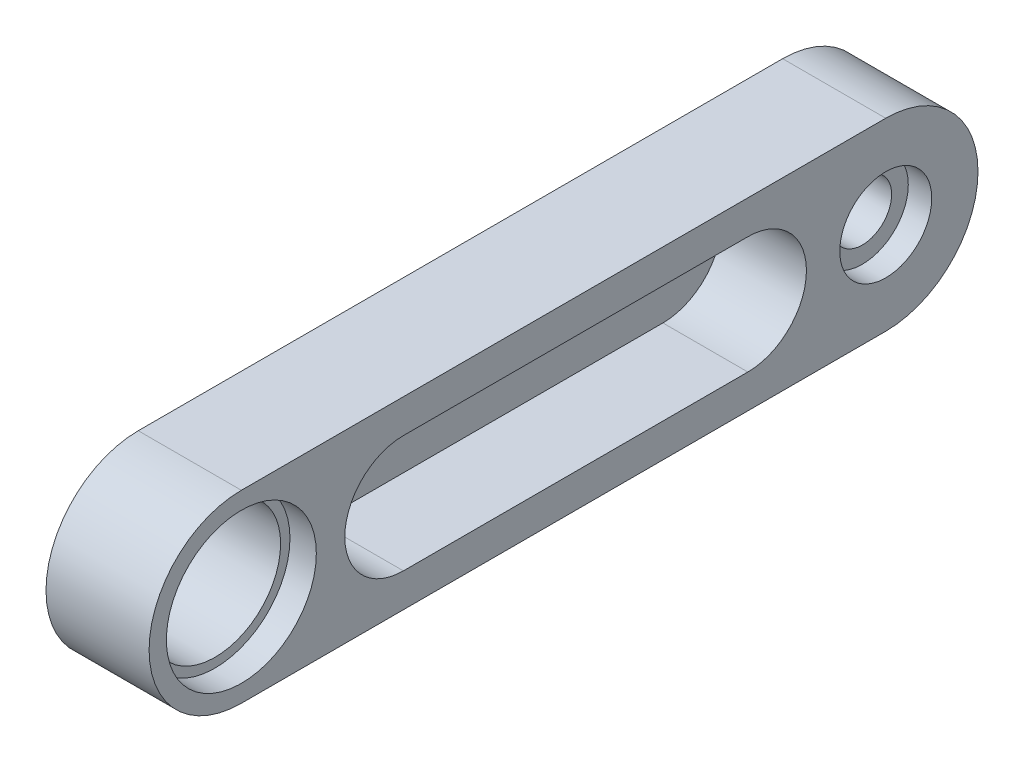
ISO-10303-21;
HEADER;
FILE_DESCRIPTION(('STEP AP214'),'2;1');
FILE_NAME('part.step','',(''),(''),'','','');
FILE_SCHEMA(('AUTOMOTIVE_DESIGN { 1 0 10303 214 1 1 1 1 }'));
ENDSEC;
DATA;
#1=APPLICATION_CONTEXT('core data for automotive mechanical design processes');
#2=APPLICATION_PROTOCOL_DEFINITION('international standard','automotive_design',2000,#1);
#3=PRODUCT_CONTEXT('',#1,'mechanical');
#4=PRODUCT('Part','Part','',(#3));
#5=PRODUCT_RELATED_PRODUCT_CATEGORY('part','',(#4));
#6=PRODUCT_DEFINITION_FORMATION('','',#4);
#7=PRODUCT_DEFINITION_CONTEXT('part definition',#1,'design');
#8=PRODUCT_DEFINITION('design','',#6,#7);
#9=PRODUCT_DEFINITION_SHAPE('','',#8);
#10=(LENGTH_UNIT() NAMED_UNIT(*) SI_UNIT(.MILLI.,.METRE.));
#11=(NAMED_UNIT(*) PLANE_ANGLE_UNIT() SI_UNIT($,.RADIAN.));
#12=(NAMED_UNIT(*) SI_UNIT($,.STERADIAN.) SOLID_ANGLE_UNIT());
#13=UNCERTAINTY_MEASURE_WITH_UNIT(LENGTH_MEASURE(1.E-05),#10,'distance_accuracy_value','');
#14=(GEOMETRIC_REPRESENTATION_CONTEXT(3) GLOBAL_UNCERTAINTY_ASSIGNED_CONTEXT((#13)) GLOBAL_UNIT_ASSIGNED_CONTEXT((#10,
#11,#12)) REPRESENTATION_CONTEXT('',''));
#15=CARTESIAN_POINT('',(0.,0.,0.));
#16=DIRECTION('',(0.,0.,1.));
#17=DIRECTION('',(1.,0.,0.));
#18=AXIS2_PLACEMENT_3D('',#15,#16,#17);
#19=CARTESIAN_POINT('',(3.48304055279405,0.,-22.9683038027636));
#20=DIRECTION('',(-1.,0.,0.));
#21=DIRECTION('',(0.,0.,1.));
#22=AXIS2_PLACEMENT_3D('',#19,#20,#21);
#23=CYLINDRICAL_SURFACE('',#22,0.762000000000001);
#24=CARTESIAN_POINT('',(0.800800552794053,0.,-22.9683038027636));
#25=DIRECTION('',(1.,0.,0.));
#26=DIRECTION('',(0.,0.,-1.));
#27=AXIS2_PLACEMENT_3D('',#24,#25,#26);
#28=CIRCLE('',#27,0.762000000000001);
#29=CARTESIAN_POINT('',(0.800800552794053,0.,-23.7303038027636));
#30=VERTEX_POINT('',#29);
#31=EDGE_CURVE('E162',#30,#30,#28,.T.);
#32=ORIENTED_EDGE('',*,*,#31,.F.);
#33=EDGE_LOOP('',(#32));
#34=FACE_BOUND('',#33,.T.);
#35=CARTESIAN_POINT('',(2.87344055279405,0.,-22.9683038027636));
#36=DIRECTION('',(1.,0.,0.));
#37=DIRECTION('',(0.,0.,-1.));
#38=AXIS2_PLACEMENT_3D('',#35,#36,#37);
#39=CIRCLE('',#38,0.762000000000001);
#40=CARTESIAN_POINT('',(2.87344055279405,0.,-23.7303038027636));
#41=VERTEX_POINT('',#40);
#42=EDGE_CURVE('E39',#41,#41,#39,.T.);
#43=ORIENTED_EDGE('',*,*,#42,.T.);
#44=EDGE_LOOP('',(#43));
#45=FACE_BOUND('',#44,.T.);
#46=ADVANCED_FACE('F35',(#34,#45),#23,.F.);
#47=CARTESIAN_POINT('',(3.48304055279405,0.,-6.20430380276362));
#48=DIRECTION('',(-1.,0.,0.));
#49=DIRECTION('',(0.,0.,1.));
#50=AXIS2_PLACEMENT_3D('',#47,#48,#49);
#51=CYLINDRICAL_SURFACE('',#50,1.70688);
#52=CARTESIAN_POINT('',(0.800800552794053,0.,-6.20430380276362));
#53=DIRECTION('',(1.,0.,0.));
#54=DIRECTION('',(0.,0.,-1.));
#55=AXIS2_PLACEMENT_3D('',#52,#53,#54);
#56=CIRCLE('',#55,1.70688);
#57=CARTESIAN_POINT('',(0.800800552794053,0.,-7.91118380276362));
#58=VERTEX_POINT('',#57);
#59=EDGE_CURVE('E165',#58,#58,#56,.T.);
#60=ORIENTED_EDGE('',*,*,#59,.F.);
#61=EDGE_LOOP('',(#60));
#62=FACE_BOUND('',#61,.T.);
#63=CARTESIAN_POINT('',(2.79724055279405,0.,-6.20430380276362));
#64=DIRECTION('',(1.,0.,0.));
#65=DIRECTION('',(0.,0.,-1.));
#66=AXIS2_PLACEMENT_3D('',#63,#64,#65);
#67=CIRCLE('',#66,1.70688);
#68=CARTESIAN_POINT('',(2.79724055279405,0.,-7.91118380276362));
#69=VERTEX_POINT('',#68);
#70=EDGE_CURVE('E158',#69,#69,#67,.T.);
#71=ORIENTED_EDGE('',*,*,#70,.T.);
#72=EDGE_LOOP('',(#71));
#73=FACE_BOUND('',#72,.T.);
#74=ADVANCED_FACE('F190',(#62,#73),#51,.F.);
#75=CARTESIAN_POINT('',(3.48304055279405,0.,-6.20430380276362));
#76=DIRECTION('',(1.,0.,0.));
#77=DIRECTION('',(0.,0.,-1.));
#78=AXIS2_PLACEMENT_3D('',#75,#76,#77);
#79=PLANE('',#78);
#80=CARTESIAN_POINT('',(3.48304055279405,0.,-10.4198990626785));
#81=DIRECTION('',(1.,0.,0.));
#82=DIRECTION('',(0.,0.,-1.));
#83=AXIS2_PLACEMENT_3D('',#80,#81,#82);
#84=CIRCLE('',#83,1.524);
#85=CARTESIAN_POINT('',(3.48304055279405,1.524,-10.4198990626785));
#86=VERTEX_POINT('',#85);
#87=CARTESIAN_POINT('',(3.48304055279405,-1.524,-10.4198990626785));
#88=VERTEX_POINT('',#87);
#89=EDGE_CURVE('E52',#86,#88,#84,.T.);
#90=ORIENTED_EDGE('',*,*,#89,.F.);
#91=DIRECTION('',(0.,0.,1.));
#92=VECTOR('',#91,1.);
#93=CARTESIAN_POINT('',(3.48304055279405,1.524,-10.4198990626785));
#94=LINE('',#93,#92);
#95=CARTESIAN_POINT('',(3.48304055279405,1.524,-19.3810190626785));
#96=VERTEX_POINT('',#95);
#97=EDGE_CURVE('E131',#96,#86,#94,.T.);
#98=ORIENTED_EDGE('',*,*,#97,.F.);
#99=CARTESIAN_POINT('',(3.48304055279405,0.,-19.3810190626785));
#100=DIRECTION('',(1.,0.,0.));
#101=DIRECTION('',(0.,0.,-1.));
#102=AXIS2_PLACEMENT_3D('',#99,#100,#101);
#103=CIRCLE('',#102,1.524);
#104=CARTESIAN_POINT('',(3.48304055279405,-1.524,-19.3810190626785));
#105=VERTEX_POINT('',#104);
#106=EDGE_CURVE('E134',#105,#96,#103,.T.);
#107=ORIENTED_EDGE('',*,*,#106,.F.);
#108=DIRECTION('',(0.,0.,-1.));
#109=VECTOR('',#108,1.);
#110=CARTESIAN_POINT('',(3.48304055279405,-1.524,-10.4198990626785));
#111=LINE('',#110,#109);
#112=EDGE_CURVE('E140',#88,#105,#111,.T.);
#113=ORIENTED_EDGE('',*,*,#112,.F.);
#114=EDGE_LOOP('',(#90,#98,#107,#113));
#115=FACE_BOUND('',#114,.T.);
#116=CARTESIAN_POINT('',(3.48304055279405,0.,-22.9683038027636));
#117=DIRECTION('',(1.,0.,0.));
#118=DIRECTION('',(0.,0.,-1.));
#119=AXIS2_PLACEMENT_3D('',#116,#117,#118);
#120=CIRCLE('',#119,1.19634);
#121=CARTESIAN_POINT('',(3.48304055279405,0.,-24.1646438027636));
#122=VERTEX_POINT('',#121);
#123=EDGE_CURVE('E146',#122,#122,#120,.T.);
#124=ORIENTED_EDGE('',*,*,#123,.F.);
#125=EDGE_LOOP('',(#124));
#126=FACE_BOUND('',#125,.T.);
#127=CARTESIAN_POINT('',(3.48304055279405,0.,-6.20430380276362));
#128=DIRECTION('',(1.,0.,0.));
#129=DIRECTION('',(0.,0.,-1.));
#130=AXIS2_PLACEMENT_3D('',#127,#128,#129);
#131=CIRCLE('',#130,1.95072);
#132=CARTESIAN_POINT('',(3.48304055279405,0.,-8.15502380276362));
#133=VERTEX_POINT('',#132);
#134=EDGE_CURVE('E159',#133,#133,#131,.T.);
#135=ORIENTED_EDGE('',*,*,#134,.F.);
#136=EDGE_LOOP('',(#135));
#137=FACE_BOUND('',#136,.T.);
#138=CARTESIAN_POINT('',(3.48304055279405,0.,-6.20430380276362));
#139=DIRECTION('',(1.,0.,0.));
#140=DIRECTION('',(0.,0.,-1.));
#141=AXIS2_PLACEMENT_3D('',#138,#139,#140);
#142=CIRCLE('',#141,2.4000000768);
#143=CARTESIAN_POINT('',(3.48304055279405,2.4000000768,-6.20430380276362));
#144=VERTEX_POINT('',#143);
#145=CARTESIAN_POINT('',(3.48304055279405,-2.4000000768,-6.20430380276362));
#146=VERTEX_POINT('',#145);
#147=EDGE_CURVE('E169',#144,#146,#142,.T.);
#148=ORIENTED_EDGE('',*,*,#147,.T.);
#149=DIRECTION('',(0.,0.,-1.));
#150=VECTOR('',#149,1.);
#151=CARTESIAN_POINT('',(3.48304055279405,-2.4000000768,-6.20430380276362));
#152=LINE('',#151,#150);
#153=CARTESIAN_POINT('',(3.48304055279405,-2.4000000768,-22.9683038027636));
#154=VERTEX_POINT('',#153);
#155=EDGE_CURVE('E89',#146,#154,#152,.T.);
#156=ORIENTED_EDGE('',*,*,#155,.T.);
#157=CARTESIAN_POINT('',(3.48304055279405,0.,-22.9683038027636));
#158=DIRECTION('',(1.,0.,0.));
#159=DIRECTION('',(0.,0.,-1.));
#160=AXIS2_PLACEMENT_3D('',#157,#158,#159);
#161=CIRCLE('',#160,2.4000000768);
#162=CARTESIAN_POINT('',(3.48304055279405,2.4000000768,-22.9683038027636));
#163=VERTEX_POINT('',#162);
#164=EDGE_CURVE('E172',#154,#163,#161,.T.);
#165=ORIENTED_EDGE('',*,*,#164,.T.);
#166=DIRECTION('',(0.,0.,1.));
#167=VECTOR('',#166,1.);
#168=CARTESIAN_POINT('',(3.48304055279405,2.4000000768,-6.20430380276362));
#169=LINE('',#168,#167);
#170=EDGE_CURVE('E61',#163,#144,#169,.T.);
#171=ORIENTED_EDGE('',*,*,#170,.T.);
#172=EDGE_LOOP('',(#148,#156,#165,#171));
#173=FACE_BOUND('',#172,.T.);
#174=ADVANCED_FACE('F206',(#115,#126,#137,#173),#79,.T.);
#175=CARTESIAN_POINT('',(0.800800552794053,0.,-6.20430380276362));
#176=DIRECTION('',(1.,0.,0.));
#177=DIRECTION('',(0.,0.,-1.));
#178=AXIS2_PLACEMENT_3D('',#175,#176,#177);
#179=PLANE('',#178);
#180=ORIENTED_EDGE('',*,*,#59,.T.);
#181=EDGE_LOOP('',(#180));
#182=FACE_BOUND('',#181,.T.);
#183=CARTESIAN_POINT('',(0.800800552794053,0.,-6.20430380276362));
#184=DIRECTION('',(1.,0.,0.));
#185=DIRECTION('',(0.,0.,-1.));
#186=AXIS2_PLACEMENT_3D('',#183,#184,#185);
#187=CIRCLE('',#186,2.4000000768);
#188=CARTESIAN_POINT('',(0.800800552794053,2.4000000768,-6.20430380276362));
#189=VERTEX_POINT('',#188);
#190=CARTESIAN_POINT('',(0.800800552794053,-2.4000000768,-6.20430380276362));
#191=VERTEX_POINT('',#190);
#192=EDGE_CURVE('E168',#189,#191,#187,.T.);
#193=ORIENTED_EDGE('',*,*,#192,.F.);
#194=DIRECTION('',(0.,0.,1.));
#195=VECTOR('',#194,1.);
#196=CARTESIAN_POINT('',(0.800800552794053,2.4000000768,-6.20430380276362));
#197=LINE('',#196,#195);
#198=CARTESIAN_POINT('',(0.800800552794053,2.4000000768,-22.9683038027636));
#199=VERTEX_POINT('',#198);
#200=EDGE_CURVE('E82',#199,#189,#197,.T.);
#201=ORIENTED_EDGE('',*,*,#200,.F.);
#202=CARTESIAN_POINT('',(0.800800552794053,0.,-22.9683038027636));
#203=DIRECTION('',(1.,0.,0.));
#204=DIRECTION('',(0.,0.,-1.));
#205=AXIS2_PLACEMENT_3D('',#202,#203,#204);
#206=CIRCLE('',#205,2.4000000768);
#207=CARTESIAN_POINT('',(0.800800552794053,-2.4000000768,-22.9683038027636));
#208=VERTEX_POINT('',#207);
#209=EDGE_CURVE('E180',#208,#199,#206,.T.);
#210=ORIENTED_EDGE('',*,*,#209,.F.);
#211=DIRECTION('',(0.,0.,-1.));
#212=VECTOR('',#211,1.);
#213=CARTESIAN_POINT('',(0.800800552794053,-2.4000000768,-6.20430380276362));
#214=LINE('',#213,#212);
#215=EDGE_CURVE('E178',#191,#208,#214,.T.);
#216=ORIENTED_EDGE('',*,*,#215,.F.);
#217=EDGE_LOOP('',(#193,#201,#210,#216));
#218=FACE_BOUND('',#217,.T.);
#219=ORIENTED_EDGE('',*,*,#31,.T.);
#220=EDGE_LOOP('',(#219));
#221=FACE_BOUND('',#220,.T.);
#222=ADVANCED_FACE('F208',(#182,#218,#221),#179,.F.);
#223=CARTESIAN_POINT('',(3.48304055279405,0.,-6.20430380276362));
#224=DIRECTION('',(-1.,0.,0.));
#225=DIRECTION('',(0.,0.,1.));
#226=AXIS2_PLACEMENT_3D('',#223,#224,#225);
#227=CYLINDRICAL_SURFACE('',#226,2.4000000768);
#228=ORIENTED_EDGE('',*,*,#192,.T.);
#229=DIRECTION('',(-1.,0.,0.));
#230=VECTOR('',#229,1.);
#231=CARTESIAN_POINT('',(3.48304055279405,-2.4000000768,-6.20430380276362));
#232=LINE('',#231,#230);
#233=EDGE_CURVE('E11',#146,#191,#232,.T.);
#234=ORIENTED_EDGE('',*,*,#233,.F.);
#235=ORIENTED_EDGE('',*,*,#147,.F.);
#236=DIRECTION('',(-1.,0.,0.));
#237=VECTOR('',#236,1.);
#238=CARTESIAN_POINT('',(3.48304055279405,2.4000000768,-6.20430380276362));
#239=LINE('',#238,#237);
#240=EDGE_CURVE('E175',#144,#189,#239,.T.);
#241=ORIENTED_EDGE('',*,*,#240,.T.);
#242=EDGE_LOOP('',(#228,#234,#235,#241));
#243=FACE_BOUND('',#242,.T.);
#244=ADVANCED_FACE('F37',(#243),#227,.T.);
#245=CARTESIAN_POINT('',(3.48304055279405,-2.4000000768,-6.20430380276362));
#246=DIRECTION('',(0.,1.,0.));
#247=DIRECTION('',(0.,0.,1.));
#248=AXIS2_PLACEMENT_3D('',#245,#246,#247);
#249=PLANE('',#248);
#250=ORIENTED_EDGE('',*,*,#215,.T.);
#251=DIRECTION('',(-1.,0.,0.));
#252=VECTOR('',#251,1.);
#253=CARTESIAN_POINT('',(3.48304055279405,-2.4000000768,-22.9683038027636));
#254=LINE('',#253,#252);
#255=EDGE_CURVE('E44',#154,#208,#254,.T.);
#256=ORIENTED_EDGE('',*,*,#255,.F.);
#257=ORIENTED_EDGE('',*,*,#155,.F.);
#258=ORIENTED_EDGE('',*,*,#233,.T.);
#259=EDGE_LOOP('',(#250,#256,#257,#258));
#260=FACE_BOUND('',#259,.T.);
#261=ADVANCED_FACE('F215',(#260),#249,.F.);
#262=CARTESIAN_POINT('',(3.48304055279405,0.,-22.9683038027636));
#263=DIRECTION('',(-1.,0.,0.));
#264=DIRECTION('',(0.,0.,1.));
#265=AXIS2_PLACEMENT_3D('',#262,#263,#264);
#266=CYLINDRICAL_SURFACE('',#265,2.4000000768);
#267=ORIENTED_EDGE('',*,*,#209,.T.);
#268=DIRECTION('',(-1.,0.,0.));
#269=VECTOR('',#268,1.);
#270=CARTESIAN_POINT('',(3.48304055279405,2.4000000768,-22.9683038027636));
#271=LINE('',#270,#269);
#272=EDGE_CURVE('E184',#163,#199,#271,.T.);
#273=ORIENTED_EDGE('',*,*,#272,.F.);
#274=ORIENTED_EDGE('',*,*,#164,.F.);
#275=ORIENTED_EDGE('',*,*,#255,.T.);
#276=EDGE_LOOP('',(#267,#273,#274,#275));
#277=FACE_BOUND('',#276,.T.);
#278=ADVANCED_FACE('F220',(#277),#266,.T.);
#279=CARTESIAN_POINT('',(3.48304055279405,2.4000000768,-6.20430380276362));
#280=DIRECTION('',(0.,-1.,0.));
#281=DIRECTION('',(0.,0.,-1.));
#282=AXIS2_PLACEMENT_3D('',#279,#280,#281);
#283=PLANE('',#282);
#284=ORIENTED_EDGE('',*,*,#200,.T.);
#285=ORIENTED_EDGE('',*,*,#240,.F.);
#286=ORIENTED_EDGE('',*,*,#170,.F.);
#287=ORIENTED_EDGE('',*,*,#272,.T.);
#288=EDGE_LOOP('',(#284,#285,#286,#287));
#289=FACE_BOUND('',#288,.T.);
#290=ADVANCED_FACE('F202',(#289),#283,.F.);
#291=CARTESIAN_POINT('',(2.79724055279405,0.,-6.20430380276362));
#292=DIRECTION('',(1.,0.,0.));
#293=DIRECTION('',(0.,0.,-1.));
#294=AXIS2_PLACEMENT_3D('',#291,#292,#293);
#295=CYLINDRICAL_SURFACE('',#294,1.95072);
#296=CARTESIAN_POINT('',(2.79724055279405,0.,-6.20430380276362));
#297=DIRECTION('',(1.,0.,0.));
#298=DIRECTION('',(0.,0.,-1.));
#299=AXIS2_PLACEMENT_3D('',#296,#297,#298);
#300=CIRCLE('',#299,1.95072);
#301=CARTESIAN_POINT('',(2.79724055279405,0.,-8.15502380276362));
#302=VERTEX_POINT('',#301);
#303=EDGE_CURVE('E155',#302,#302,#300,.T.);
#304=ORIENTED_EDGE('',*,*,#303,.F.);
#305=EDGE_LOOP('',(#304));
#306=FACE_BOUND('',#305,.T.);
#307=ORIENTED_EDGE('',*,*,#134,.T.);
#308=EDGE_LOOP('',(#307));
#309=FACE_BOUND('',#308,.T.);
#310=ADVANCED_FACE('F196',(#306,#309),#295,.F.);
#311=CARTESIAN_POINT('',(2.79724055279405,0.,-6.20430380276362));
#312=DIRECTION('',(1.,0.,0.));
#313=DIRECTION('',(0.,0.,-1.));
#314=AXIS2_PLACEMENT_3D('',#311,#312,#313);
#315=PLANE('',#314);
#316=ORIENTED_EDGE('',*,*,#70,.F.);
#317=EDGE_LOOP('',(#316));
#318=FACE_BOUND('',#317,.T.);
#319=ORIENTED_EDGE('',*,*,#303,.T.);
#320=EDGE_LOOP('',(#319));
#321=FACE_BOUND('',#320,.T.);
#322=ADVANCED_FACE('F192',(#318,#321),#315,.T.);
#323=CARTESIAN_POINT('',(2.87344055279405,0.,-22.9683038027636));
#324=DIRECTION('',(1.,0.,0.));
#325=DIRECTION('',(0.,0.,-1.));
#326=AXIS2_PLACEMENT_3D('',#323,#324,#325);
#327=CYLINDRICAL_SURFACE('',#326,1.19634);
#328=CARTESIAN_POINT('',(2.87344055279405,0.,-22.9683038027636));
#329=DIRECTION('',(1.,0.,0.));
#330=DIRECTION('',(0.,0.,-1.));
#331=AXIS2_PLACEMENT_3D('',#328,#329,#330);
#332=CIRCLE('',#331,1.19634);
#333=CARTESIAN_POINT('',(2.87344055279405,0.,-24.1646438027636));
#334=VERTEX_POINT('',#333);
#335=EDGE_CURVE('E150',#334,#334,#332,.T.);
#336=ORIENTED_EDGE('',*,*,#335,.F.);
#337=EDGE_LOOP('',(#336));
#338=FACE_BOUND('',#337,.T.);
#339=ORIENTED_EDGE('',*,*,#123,.T.);
#340=EDGE_LOOP('',(#339));
#341=FACE_BOUND('',#340,.T.);
#342=ADVANCED_FACE('F195',(#338,#341),#327,.F.);
#343=CARTESIAN_POINT('',(2.87344055279405,0.,-22.9683038027636));
#344=DIRECTION('',(1.,0.,0.));
#345=DIRECTION('',(0.,0.,-1.));
#346=AXIS2_PLACEMENT_3D('',#343,#344,#345);
#347=PLANE('',#346);
#348=ORIENTED_EDGE('',*,*,#42,.F.);
#349=EDGE_LOOP('',(#348));
#350=FACE_BOUND('',#349,.T.);
#351=ORIENTED_EDGE('',*,*,#335,.T.);
#352=EDGE_LOOP('',(#351));
#353=FACE_BOUND('',#352,.T.);
#354=ADVANCED_FACE('F234',(#350,#353),#347,.T.);
#355=CARTESIAN_POINT('',(1.27324055279405,0.,-10.4198990626785));
#356=DIRECTION('',(1.,0.,0.));
#357=DIRECTION('',(0.,0.,-1.));
#358=AXIS2_PLACEMENT_3D('',#355,#356,#357);
#359=CYLINDRICAL_SURFACE('',#358,1.524);
#360=ORIENTED_EDGE('',*,*,#89,.T.);
#361=DIRECTION('',(1.,0.,0.));
#362=VECTOR('',#361,1.);
#363=CARTESIAN_POINT('',(1.27324055279405,-1.524,-10.4198990626785));
#364=LINE('',#363,#362);
#365=CARTESIAN_POINT('',(1.27324055279405,-1.524,-10.4198990626785));
#366=VERTEX_POINT('',#365);
#367=EDGE_CURVE('E109',#366,#88,#364,.T.);
#368=ORIENTED_EDGE('',*,*,#367,.F.);
#369=CARTESIAN_POINT('',(1.27324055279405,0.,-10.4198990626785));
#370=DIRECTION('',(1.,0.,0.));
#371=DIRECTION('',(0.,0.,-1.));
#372=AXIS2_PLACEMENT_3D('',#369,#370,#371);
#373=CIRCLE('',#372,1.524);
#374=CARTESIAN_POINT('',(1.27324055279405,1.524,-10.4198990626785));
#375=VERTEX_POINT('',#374);
#376=EDGE_CURVE('E113',#375,#366,#373,.T.);
#377=ORIENTED_EDGE('',*,*,#376,.F.);
#378=DIRECTION('',(1.,0.,0.));
#379=VECTOR('',#378,1.);
#380=CARTESIAN_POINT('',(1.27324055279405,1.524,-10.4198990626785));
#381=LINE('',#380,#379);
#382=EDGE_CURVE('E144',#375,#86,#381,.T.);
#383=ORIENTED_EDGE('',*,*,#382,.T.);
#384=EDGE_LOOP('',(#360,#368,#377,#383));
#385=FACE_BOUND('',#384,.T.);
#386=ADVANCED_FACE('F111',(#385),#359,.F.);
#387=CARTESIAN_POINT('',(1.27324055279405,1.524,-10.4198990626785));
#388=DIRECTION('',(0.,1.,0.));
#389=DIRECTION('',(0.,0.,1.));
#390=AXIS2_PLACEMENT_3D('',#387,#388,#389);
#391=PLANE('',#390);
#392=ORIENTED_EDGE('',*,*,#97,.T.);
#393=ORIENTED_EDGE('',*,*,#382,.F.);
#394=DIRECTION('',(0.,0.,1.));
#395=VECTOR('',#394,1.);
#396=CARTESIAN_POINT('',(1.27324055279405,1.524,-10.4198990626785));
#397=LINE('',#396,#395);
#398=CARTESIAN_POINT('',(1.27324055279405,1.524,-19.3810190626785));
#399=VERTEX_POINT('',#398);
#400=EDGE_CURVE('E119',#399,#375,#397,.T.);
#401=ORIENTED_EDGE('',*,*,#400,.F.);
#402=DIRECTION('',(1.,0.,0.));
#403=VECTOR('',#402,1.);
#404=CARTESIAN_POINT('',(1.27324055279405,1.524,-19.3810190626785));
#405=LINE('',#404,#403);
#406=EDGE_CURVE('E147',#399,#96,#405,.T.);
#407=ORIENTED_EDGE('',*,*,#406,.T.);
#408=EDGE_LOOP('',(#392,#393,#401,#407));
#409=FACE_BOUND('',#408,.T.);
#410=ADVANCED_FACE('F301',(#409),#391,.F.);
#411=CARTESIAN_POINT('',(1.27324055279405,0.,-19.3810190626785));
#412=DIRECTION('',(1.,0.,0.));
#413=DIRECTION('',(0.,0.,-1.));
#414=AXIS2_PLACEMENT_3D('',#411,#412,#413);
#415=CYLINDRICAL_SURFACE('',#414,1.524);
#416=ORIENTED_EDGE('',*,*,#106,.T.);
#417=ORIENTED_EDGE('',*,*,#406,.F.);
#418=CARTESIAN_POINT('',(1.27324055279405,0.,-19.3810190626785));
#419=DIRECTION('',(1.,0.,0.));
#420=DIRECTION('',(0.,0.,-1.));
#421=AXIS2_PLACEMENT_3D('',#418,#419,#420);
#422=CIRCLE('',#421,1.524);
#423=CARTESIAN_POINT('',(1.27324055279405,-1.524,-19.3810190626785));
#424=VERTEX_POINT('',#423);
#425=EDGE_CURVE('E127',#424,#399,#422,.T.);
#426=ORIENTED_EDGE('',*,*,#425,.F.);
#427=DIRECTION('',(1.,0.,0.));
#428=VECTOR('',#427,1.);
#429=CARTESIAN_POINT('',(1.27324055279405,-1.524,-19.3810190626785));
#430=LINE('',#429,#428);
#431=EDGE_CURVE('E118',#424,#105,#430,.T.);
#432=ORIENTED_EDGE('',*,*,#431,.T.);
#433=EDGE_LOOP('',(#416,#417,#426,#432));
#434=FACE_BOUND('',#433,.T.);
#435=ADVANCED_FACE('F308',(#434),#415,.F.);
#436=CARTESIAN_POINT('',(1.27324055279405,-1.524,-10.4198990626785));
#437=DIRECTION('',(0.,-1.,0.));
#438=DIRECTION('',(0.,0.,-1.));
#439=AXIS2_PLACEMENT_3D('',#436,#437,#438);
#440=PLANE('',#439);
#441=ORIENTED_EDGE('',*,*,#112,.T.);
#442=ORIENTED_EDGE('',*,*,#431,.F.);
#443=DIRECTION('',(0.,0.,-1.));
#444=VECTOR('',#443,1.);
#445=CARTESIAN_POINT('',(1.27324055279405,-1.524,-10.4198990626785));
#446=LINE('',#445,#444);
#447=EDGE_CURVE('E122',#366,#424,#446,.T.);
#448=ORIENTED_EDGE('',*,*,#447,.F.);
#449=ORIENTED_EDGE('',*,*,#367,.T.);
#450=EDGE_LOOP('',(#441,#442,#448,#449));
#451=FACE_BOUND('',#450,.T.);
#452=ADVANCED_FACE('F123',(#451),#440,.F.);
#453=CARTESIAN_POINT('',(1.27324055279405,0.,-10.4198990626785));
#454=DIRECTION('',(1.,0.,0.));
#455=DIRECTION('',(0.,0.,-1.));
#456=AXIS2_PLACEMENT_3D('',#453,#454,#455);
#457=PLANE('',#456);
#458=ORIENTED_EDGE('',*,*,#376,.T.);
#459=ORIENTED_EDGE('',*,*,#447,.T.);
#460=ORIENTED_EDGE('',*,*,#425,.T.);
#461=ORIENTED_EDGE('',*,*,#400,.T.);
#462=EDGE_LOOP('',(#458,#459,#460,#461));
#463=FACE_BOUND('',#462,.T.);
#464=ADVANCED_FACE('F129',(#463),#457,.T.);
#465=CLOSED_SHELL('',(#46,#74,#174,#222,#244,#261,#278,#290,#310,#322,#342,#354,#386,#410,#435,
#452,#464));
#466=MANIFOLD_SOLID_BREP('B2',#465);
#467=ADVANCED_BREP_SHAPE_REPRESENTATION('',(#18,#466),#14);
#468=SHAPE_DEFINITION_REPRESENTATION(#9,#467);
ENDSEC;
END-ISO-10303-21;
